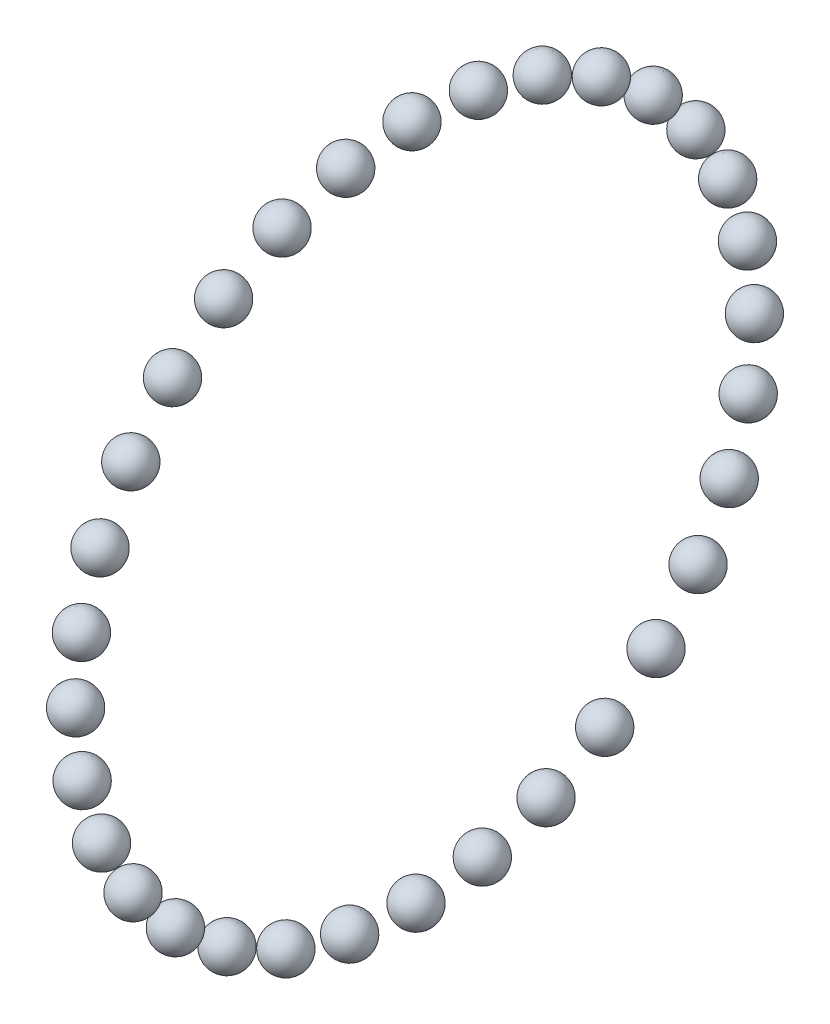
ISO-10303-21;
HEADER;
FILE_DESCRIPTION(('STEP AP214'),'2;1');
FILE_NAME('part.step','',(''),(''),'','','');
FILE_SCHEMA(('AUTOMOTIVE_DESIGN { 1 0 10303 214 1 1 1 1 }'));
ENDSEC;
DATA;
#1=APPLICATION_CONTEXT('core data for automotive mechanical design processes');
#2=APPLICATION_PROTOCOL_DEFINITION('international standard','automotive_design',2000,#1);
#3=PRODUCT_CONTEXT('',#1,'mechanical');
#4=PRODUCT('Part','Part','',(#3));
#5=PRODUCT_RELATED_PRODUCT_CATEGORY('part','',(#4));
#6=PRODUCT_DEFINITION_FORMATION('','',#4);
#7=PRODUCT_DEFINITION_CONTEXT('part definition',#1,'design');
#8=PRODUCT_DEFINITION('design','',#6,#7);
#9=PRODUCT_DEFINITION_SHAPE('','',#8);
#10=(LENGTH_UNIT() NAMED_UNIT(*) SI_UNIT(.MILLI.,.METRE.));
#11=(NAMED_UNIT(*) PLANE_ANGLE_UNIT() SI_UNIT($,.RADIAN.));
#12=(NAMED_UNIT(*) SI_UNIT($,.STERADIAN.) SOLID_ANGLE_UNIT());
#13=UNCERTAINTY_MEASURE_WITH_UNIT(LENGTH_MEASURE(1.E-05),#10,'distance_accuracy_value','');
#14=(GEOMETRIC_REPRESENTATION_CONTEXT(3) GLOBAL_UNCERTAINTY_ASSIGNED_CONTEXT((#13)) GLOBAL_UNIT_ASSIGNED_CONTEXT((#10,
#11,#12)) REPRESENTATION_CONTEXT('',''));
#15=CARTESIAN_POINT('',(0.,0.,0.));
#16=DIRECTION('',(0.,0.,1.));
#17=DIRECTION('',(1.,0.,0.));
#18=AXIS2_PLACEMENT_3D('',#15,#16,#17);
#19=CARTESIAN_POINT('',(0.,19.6178931008394,-1.81811366279537));
#20=DIRECTION('',(-1.,0.,0.));
#21=DIRECTION('',(0.,1.,0.));
#22=AXIS2_PLACEMENT_3D('',#19,#20,#21);
#23=SPHERICAL_SURFACE('',#22,6.5);
#24=CARTESIAN_POINT('',(-6.5,19.6178931008394,-1.81811366279537));
#25=VERTEX_POINT('',#24);
#26=VERTEX_LOOP('',#25);
#27=FACE_BOUND('',#26,.T.);
#28=ADVANCED_FACE('F38',(#27),#23,.T.);
#29=CLOSED_SHELL('',(#28));
#30=MANIFOLD_SOLID_BREP('B2',#29);
#31=CARTESIAN_POINT('',(0.,39.7489716881092,-7.67638217094377));
#32=DIRECTION('',(-1.,0.,0.));
#33=DIRECTION('',(0.,1.,0.));
#34=AXIS2_PLACEMENT_3D('',#31,#32,#33);
#35=SPHERICAL_SURFACE('',#34,6.5);
#36=CARTESIAN_POINT('',(-6.5,39.7489716881092,-7.67638217094377));
#37=VERTEX_POINT('',#36);
#38=VERTEX_LOOP('',#37);
#39=FACE_BOUND('',#38,.T.);
#40=ADVANCED_FACE('F57',(#39),#35,.T.);
#41=CLOSED_SHELL('',(#40));
#42=MANIFOLD_SOLID_BREP('B6',#41);
#43=CARTESIAN_POINT('',(0.,58.3467483022382,-17.3563790723563));
#44=DIRECTION('',(-1.,0.,0.));
#45=DIRECTION('',(0.,1.,0.));
#46=AXIS2_PLACEMENT_3D('',#43,#44,#45);
#47=SPHERICAL_SURFACE('',#46,6.5);
#48=CARTESIAN_POINT('',(-6.5,58.3467483022382,-17.3563790723563));
#49=VERTEX_POINT('',#48);
#50=VERTEX_LOOP('',#49);
#51=FACE_BOUND('',#50,.T.);
#52=ADVANCED_FACE('F76',(#51),#47,.T.);
#53=CLOSED_SHELL('',(#52));
#54=MANIFOLD_SOLID_BREP('B34',#53);
#55=CARTESIAN_POINT('',(0.,74.6938205459459,-30.4847020444422));
#56=DIRECTION('',(-1.,0.,0.));
#57=DIRECTION('',(0.,1.,0.));
#58=AXIS2_PLACEMENT_3D('',#55,#56,#57);
#59=SPHERICAL_SURFACE('',#58,6.5);
#60=CARTESIAN_POINT('',(-6.5,74.6938205459459,-30.4847020444422));
#61=VERTEX_POINT('',#60);
#62=VERTEX_LOOP('',#61);
#63=FACE_BOUND('',#62,.T.);
#64=ADVANCED_FACE('F95',(#63),#59,.T.);
#65=CLOSED_SHELL('',(#64));
#66=MANIFOLD_SOLID_BREP('B53',#65);
#67=CARTESIAN_POINT('',(0.,88.1596061157951,-46.554930853866));
#68=DIRECTION('',(-1.,0.,0.));
#69=DIRECTION('',(0.,1.,0.));
#70=AXIS2_PLACEMENT_3D('',#67,#68,#69);
#71=SPHERICAL_SURFACE('',#70,6.5);
#72=CARTESIAN_POINT('',(-6.5,88.1596061157951,-46.554930853866));
#73=VERTEX_POINT('',#72);
#74=VERTEX_LOOP('',#73);
#75=FACE_BOUND('',#74,.T.);
#76=ADVANCED_FACE('F114',(#75),#71,.T.);
#77=CLOSED_SHELL('',(#76));
#78=MANIFOLD_SOLID_BREP('B72',#77);
#79=CARTESIAN_POINT('',(0.,98.2246672827762,-64.9471623309145));
#80=DIRECTION('',(-1.,0.,0.));
#81=DIRECTION('',(0.,1.,0.));
#82=AXIS2_PLACEMENT_3D('',#79,#80,#81);
#83=SPHERICAL_SURFACE('',#82,6.5);
#84=CARTESIAN_POINT('',(-6.5,98.2246672827762,-64.9471623309145));
#85=VERTEX_POINT('',#84);
#86=VERTEX_LOOP('',#85);
#87=FACE_BOUND('',#86,.T.);
#88=ADVANCED_FACE('F133',(#87),#83,.T.);
#89=CLOSED_SHELL('',(#88));
#90=MANIFOLD_SOLID_BREP('B91',#89);
#91=CARTESIAN_POINT('',(0.,104.500748011784,-84.9519229064218));
#92=DIRECTION('',(-1.,0.,0.));
#93=DIRECTION('',(0.,1.,0.));
#94=AXIS2_PLACEMENT_3D('',#91,#92,#93);
#95=SPHERICAL_SURFACE('',#94,6.5);
#96=CARTESIAN_POINT('',(-6.5,104.500748011784,-84.9519229064218));
#97=VERTEX_POINT('',#96);
#98=VERTEX_LOOP('',#97);
#99=FACE_BOUND('',#98,.T.);
#100=ADVANCED_FACE('F152',(#99),#95,.T.);
#101=CLOSED_SHELL('',(#100));
#102=MANIFOLD_SOLID_BREP('B110',#101);
#103=CARTESIAN_POINT('',(0.,106.74575079547,-105.797536293934));
#104=DIRECTION('',(-1.,0.,0.));
#105=DIRECTION('',(0.,1.,0.));
#106=AXIS2_PLACEMENT_3D('',#103,#104,#105);
#107=SPHERICAL_SURFACE('',#106,6.5);
#108=CARTESIAN_POINT('',(-6.5,106.74575079547,-105.797536293934));
#109=VERTEX_POINT('',#108);
#110=VERTEX_LOOP('',#109);
#111=FACE_BOUND('',#110,.T.);
#112=ADVANCED_FACE('F171',(#111),#107,.T.);
#113=CLOSED_SHELL('',(#112));
#114=MANIFOLD_SOLID_BREP('B129',#113);
#115=CARTESIAN_POINT('',(0.,104.873075476604,-126.67989061883));
#116=DIRECTION('',(-1.,0.,0.));
#117=DIRECTION('',(0.,1.,0.));
#118=AXIS2_PLACEMENT_3D('',#115,#116,#117);
#119=SPHERICAL_SURFACE('',#118,6.5);
#120=CARTESIAN_POINT('',(-6.5,104.873075476604,-126.67989061883));
#121=VERTEX_POINT('',#120);
#122=VERTEX_LOOP('',#121);
#123=FACE_BOUND('',#122,.T.);
#124=ADVANCED_FACE('F190',(#123),#119,.T.);
#125=CLOSED_SHELL('',(#124));
#126=MANIFOLD_SOLID_BREP('B148',#125);
#127=CARTESIAN_POINT('',(0.,98.9549598173089,-146.793456738333));
#128=DIRECTION('',(-1.,0.,0.));
#129=DIRECTION('',(0.,1.,0.));
#130=AXIS2_PLACEMENT_3D('',#127,#128,#129);
#131=SPHERICAL_SURFACE('',#130,6.5);
#132=CARTESIAN_POINT('',(-6.5,98.9549598173089,-146.793456738333));
#133=VERTEX_POINT('',#132);
#134=VERTEX_LOOP('',#133);
#135=FACE_BOUND('',#134,.T.);
#136=ADVANCED_FACE('F209',(#135),#131,.T.);
#137=CLOSED_SHELL('',(#136));
#138=MANIFOLD_SOLID_BREP('B167',#137);
#139=CARTESIAN_POINT('',(0.,89.2196929539404,-165.362361232121));
#140=DIRECTION('',(-1.,0.,0.));
#141=DIRECTION('',(0.,1.,0.));
#142=AXIS2_PLACEMENT_3D('',#139,#140,#141);
#143=SPHERICAL_SURFACE('',#142,6.5);
#144=CARTESIAN_POINT('',(-6.5,89.2196929539404,-165.362361232121));
#145=VERTEX_POINT('',#144);
#146=VERTEX_LOOP('',#145);
#147=FACE_BOUND('',#146,.T.);
#148=ADVANCED_FACE('F228',(#147),#143,.T.);
#149=CLOSED_SHELL('',(#148));
#150=MANIFOLD_SOLID_BREP('B186',#149);
#151=CARTESIAN_POINT('',(0.,76.0428092275569,-181.670315434342));
#152=DIRECTION('',(-1.,0.,0.));
#153=DIRECTION('',(0.,1.,0.));
#154=AXIS2_PLACEMENT_3D('',#151,#152,#153);
#155=SPHERICAL_SURFACE('',#154,6.5);
#156=CARTESIAN_POINT('',(-6.5,76.0428092275569,-181.670315434342));
#157=VERTEX_POINT('',#156);
#158=VERTEX_LOOP('',#157);
#159=FACE_BOUND('',#158,.T.);
#160=ADVANCED_FACE('F247',(#159),#155,.T.);
#161=CLOSED_SHELL('',(#160));
#162=MANIFOLD_SOLID_BREP('B205',#161);
#163=CARTESIAN_POINT('',(0.,59.9326020847422,-195.088246005634));
#164=DIRECTION('',(-1.,0.,0.));
#165=DIRECTION('',(0.,1.,0.));
#166=AXIS2_PLACEMENT_3D('',#163,#164,#165);
#167=SPHERICAL_SURFACE('',#166,6.5);
#168=CARTESIAN_POINT('',(-6.5,59.9326020847422,-195.088246005634));
#169=VERTEX_POINT('',#168);
#170=VERTEX_LOOP('',#169);
#171=FACE_BOUND('',#170,.T.);
#172=ADVANCED_FACE('F266',(#171),#167,.T.);
#173=CLOSED_SHELL('',(#172));
#174=MANIFOLD_SOLID_BREP('B224',#173);
#175=CARTESIAN_POINT('',(0.,41.5105168447267,-205.098561205966));
#176=DIRECTION('',(-1.,0.,0.));
#177=DIRECTION('',(0.,1.,0.));
#178=AXIS2_PLACEMENT_3D('',#175,#176,#177);
#179=SPHERICAL_SURFACE('',#178,6.5);
#180=CARTESIAN_POINT('',(-6.5,41.5105168447267,-205.098561205966));
#181=VERTEX_POINT('',#180);
#182=VERTEX_LOOP('',#181);
#183=FACE_BOUND('',#182,.T.);
#184=ADVANCED_FACE('F285',(#183),#179,.T.);
#185=CLOSED_SHELL('',(#184));
#186=MANIFOLD_SOLID_BREP('B243',#185);
#187=CARTESIAN_POINT('',(0.,21.4871786746092,-211.315116805775));
#188=DIRECTION('',(-1.,0.,0.));
#189=DIRECTION('',(0.,1.,0.));
#190=AXIS2_PLACEMENT_3D('',#187,#188,#189);
#191=SPHERICAL_SURFACE('',#190,6.5);
#192=CARTESIAN_POINT('',(-6.5,21.4871786746092,-211.315116805775));
#193=VERTEX_POINT('',#192);
#194=VERTEX_LOOP('',#193);
#195=FACE_BOUND('',#194,.T.);
#196=ADVANCED_FACE('F304',(#195),#191,.T.);
#197=CLOSED_SHELL('',(#196));
#198=MANIFOLD_SOLID_BREP('B262',#197);
#199=CARTESIAN_POINT('',(0.,0.634980484727721,-213.498111457693));
#200=DIRECTION('',(-1.,0.,0.));
#201=DIRECTION('',(0.,1.,0.));
#202=AXIS2_PLACEMENT_3D('',#199,#200,#201);
#203=SPHERICAL_SURFACE('',#202,6.5);
#204=CARTESIAN_POINT('',(-6.5,0.634980484727721,-213.498111457693));
#205=VERTEX_POINT('',#204);
#206=VERTEX_LOOP('',#205);
#207=FACE_BOUND('',#206,.T.);
#208=ADVANCED_FACE('F323',(#207),#203,.T.);
#209=CLOSED_SHELL('',(#208));
#210=MANIFOLD_SOLID_BREP('B281',#209);
#211=CARTESIAN_POINT('',(0.,-20.2417118439652,-211.563336945381));
#212=DIRECTION('',(-1.,0.,0.));
#213=DIRECTION('',(0.,1.,0.));
#214=AXIS2_PLACEMENT_3D('',#211,#212,#213);
#215=SPHERICAL_SURFACE('',#214,6.5);
#216=CARTESIAN_POINT('',(-6.5,-20.2417118439652,-211.563336945381));
#217=VERTEX_POINT('',#216);
#218=VERTEX_LOOP('',#217);
#219=FACE_BOUND('',#218,.T.);
#220=ADVANCED_FACE('F342',(#219),#215,.T.);
#221=CLOSED_SHELL('',(#220));
#222=MANIFOLD_SOLID_BREP('B300',#221);
#223=CARTESIAN_POINT('',(0.,-40.337587578115,-205.585426484525));
#224=DIRECTION('',(-1.,0.,0.));
#225=DIRECTION('',(0.,1.,0.));
#226=AXIS2_PLACEMENT_3D('',#223,#224,#225);
#227=SPHERICAL_SURFACE('',#226,6.5);
#228=CARTESIAN_POINT('',(-6.5,-40.337587578115,-205.585426484525));
#229=VERTEX_POINT('',#228);
#230=VERTEX_LOOP('',#229);
#231=FACE_BOUND('',#230,.T.);
#232=ADVANCED_FACE('F361',(#231),#227,.T.);
#233=CLOSED_SHELL('',(#232));
#234=MANIFOLD_SOLID_BREP('B319',#233);
#235=CARTESIAN_POINT('',(0.,-58.8774556975125,-195.794975773973));
#236=DIRECTION('',(-1.,0.,0.));
#237=DIRECTION('',(0.,1.,0.));
#238=AXIS2_PLACEMENT_3D('',#235,#236,#237);
#239=SPHERICAL_SURFACE('',#238,6.5);
#240=CARTESIAN_POINT('',(-6.5,-58.8774556975125,-195.794975773973));
#241=VERTEX_POINT('',#240);
#242=VERTEX_LOOP('',#241);
#243=FACE_BOUND('',#242,.T.);
#244=ADVANCED_FACE('F380',(#243),#239,.T.);
#245=CLOSED_SHELL('',(#244));
#246=MANIFOLD_SOLID_BREP('B338',#245);
#247=CARTESIAN_POINT('',(0.,-75.1461476037777,-182.569647851406));
#248=DIRECTION('',(-1.,0.,0.));
#249=DIRECTION('',(0.,1.,0.));
#250=AXIS2_PLACEMENT_3D('',#247,#248,#249);
#251=SPHERICAL_SURFACE('',#250,6.5);
#252=CARTESIAN_POINT('',(-6.5,-75.1461476037777,-182.569647851406));
#253=VERTEX_POINT('',#252);
#254=VERTEX_LOOP('',#253);
#255=FACE_BOUND('',#254,.T.);
#256=ADVANCED_FACE('F399',(#255),#251,.T.);
#257=CLOSED_SHELL('',(#256));
#258=MANIFOLD_SOLID_BREP('B357',#257);
#259=CARTESIAN_POINT('',(0.,-88.5161044861811,-166.41960488047));
#260=DIRECTION('',(-1.,0.,0.));
#261=DIRECTION('',(0.,1.,0.));
#262=AXIS2_PLACEMENT_3D('',#259,#260,#261);
#263=SPHERICAL_SURFACE('',#262,6.5);
#264=CARTESIAN_POINT('',(-6.5,-88.5161044861811,-166.41960488047));
#265=VERTEX_POINT('',#264);
#266=VERTEX_LOOP('',#265);
#267=FACE_BOUND('',#266,.T.);
#268=ADVANCED_FACE('F418',(#267),#263,.T.);
#269=CLOSED_SHELL('',(#268));
#270=MANIFOLD_SOLID_BREP('B376',#269);
#271=CARTESIAN_POINT('',(0.,-98.4715851721095,-147.967828832824));
#272=DIRECTION('',(-1.,0.,0.));
#273=DIRECTION('',(0.,1.,0.));
#274=AXIS2_PLACEMENT_3D('',#271,#272,#273);
#275=SPHERICAL_SURFACE('',#274,6.5);
#276=CARTESIAN_POINT('',(-6.5,-98.4715851721095,-147.967828832824));
#277=VERTEX_POINT('',#276);
#278=VERTEX_LOOP('',#277);
#279=FACE_BOUND('',#278,.T.);
#280=ADVANCED_FACE('F437',(#279),#275,.T.);
#281=CLOSED_SHELL('',(#280));
#282=MANIFOLD_SOLID_BREP('B395',#281);
#283=CARTESIAN_POINT('',(0.,-104.628560653239,-127.926090187557));
#284=DIRECTION('',(-1.,0.,0.));
#285=DIRECTION('',(0.,1.,0.));
#286=AXIS2_PLACEMENT_3D('',#283,#284,#285);
#287=SPHERICAL_SURFACE('',#286,6.5);
#288=CARTESIAN_POINT('',(-6.5,-104.628560653239,-127.926090187557));
#289=VERTEX_POINT('',#288);
#290=VERTEX_LOOP('',#289);
#291=FACE_BOUND('',#290,.T.);
#292=ADVANCED_FACE('F456',(#291),#287,.T.);
#293=CLOSED_SHELL('',(#292));
#294=MANIFOLD_SOLID_BREP('B414',#293);
#295=CARTESIAN_POINT('',(0.,-106.749527863379,-107.067491646574));
#296=DIRECTION('',(-1.,0.,0.));
#297=DIRECTION('',(0.,1.,0.));
#298=AXIS2_PLACEMENT_3D('',#295,#296,#297);
#299=SPHERICAL_SURFACE('',#298,6.5);
#300=CARTESIAN_POINT('',(-6.5,-106.749527863379,-107.067491646574));
#301=VERTEX_POINT('',#300);
#302=VERTEX_LOOP('',#301);
#303=FACE_BOUND('',#302,.T.);
#304=ADVANCED_FACE('F475',(#303),#299,.T.);
#305=CLOSED_SHELL('',(#304));
#306=MANIFOLD_SOLID_BREP('B433',#305);
#307=CARTESIAN_POINT('',(0.,-104.752671271961,-86.1966459820182));
#308=DIRECTION('',(-1.,0.,0.));
#309=DIRECTION('',(0.,1.,0.));
#310=AXIS2_PLACEMENT_3D('',#307,#308,#309);
#311=SPHERICAL_SURFACE('',#310,6.5);
#312=CARTESIAN_POINT('',(-6.5,-104.752671271961,-86.1966459820182));
#313=VERTEX_POINT('',#312);
#314=VERTEX_LOOP('',#313);
#315=FACE_BOUND('',#314,.T.);
#316=ADVANCED_FACE('F494',(#315),#311,.T.);
#317=CLOSED_SHELL('',(#316));
#318=MANIFOLD_SOLID_BREP('B452',#317);
#319=CARTESIAN_POINT('',(0.,-98.7150188880537,-66.1186383943241));
#320=DIRECTION('',(-1.,0.,0.));
#321=DIRECTION('',(0.,1.,0.));
#322=AXIS2_PLACEMENT_3D('',#319,#320,#321);
#323=SPHERICAL_SURFACE('',#322,6.5);
#324=CARTESIAN_POINT('',(-6.5,-98.7150188880537,-66.1186383943241));
#325=VERTEX_POINT('',#324);
#326=VERTEX_LOOP('',#325);
#327=FACE_BOUND('',#326,.T.);
#328=ADVANCED_FACE('F513',(#327),#323,.T.);
#329=CLOSED_SHELL('',(#328));
#330=MANIFOLD_SOLID_BREP('B471',#329);
#331=CARTESIAN_POINT('',(0.,-88.8694709332286,-47.6079706465188));
#332=DIRECTION('',(-1.,0.,0.));
#333=DIRECTION('',(0.,1.,0.));
#334=AXIS2_PLACEMENT_3D('',#331,#332,#333);
#335=SPHERICAL_SURFACE('',#334,6.5);
#336=CARTESIAN_POINT('',(-6.5,-88.8694709332286,-47.6079706465188));
#337=VERTEX_POINT('',#336);
#338=VERTEX_LOOP('',#337);
#339=FACE_BOUND('',#338,.T.);
#340=ADVANCED_FACE('F532',(#339),#335,.T.);
#341=CLOSED_SHELL('',(#340));
#342=MANIFOLD_SOLID_BREP('B490',#341);
#343=CARTESIAN_POINT('',(0.,-75.5958158011134,-31.378684943381));
#344=DIRECTION('',(-1.,0.,0.));
#345=DIRECTION('',(0.,1.,0.));
#346=AXIS2_PLACEMENT_3D('',#343,#344,#345);
#347=SPHERICAL_SURFACE('',#346,6.5);
#348=CARTESIAN_POINT('',(-6.5,-75.5958158011134,-31.378684943381));
#349=VERTEX_POINT('',#348);
#350=VERTEX_LOOP('',#349);
#351=FACE_BOUND('',#350,.T.);
#352=ADVANCED_FACE('F551',(#351),#347,.T.);
#353=CLOSED_SHELL('',(#352));
#354=MANIFOLD_SOLID_BREP('B509',#353);
#355=CARTESIAN_POINT('',(0.,-59.4060798597,-18.0568200158381));
#356=DIRECTION('',(-1.,0.,0.));
#357=DIRECTION('',(0.,1.,0.));
#358=AXIS2_PLACEMENT_3D('',#355,#356,#357);
#359=SPHERICAL_SURFACE('',#358,6.5);
#360=CARTESIAN_POINT('',(-6.5,-59.4060798597,-18.0568200158381));
#361=VERTEX_POINT('',#360);
#362=VERTEX_LOOP('',#361);
#363=FACE_BOUND('',#362,.T.);
#364=ADVANCED_FACE('F570',(#363),#359,.T.);
#365=CLOSED_SHELL('',(#364));
#366=MANIFOLD_SOLID_BREP('B528',#365);
#367=CARTESIAN_POINT('',(0.,-40.9247762223932,-8.15626190702053));
#368=DIRECTION('',(-1.,0.,0.));
#369=DIRECTION('',(0.,1.,0.));
#370=AXIS2_PLACEMENT_3D('',#367,#368,#369);
#371=SPHERICAL_SURFACE('',#370,6.5);
#372=CARTESIAN_POINT('',(-6.5,-40.9247762223932,-8.15626190702053));
#373=VERTEX_POINT('',#372);
#374=VERTEX_LOOP('',#373);
#375=FACE_BOUND('',#374,.T.);
#376=ADVANCED_FACE('F589',(#375),#371,.T.);
#377=CLOSED_SHELL('',(#376));
#378=MANIFOLD_SOLID_BREP('B547',#377);
#379=CARTESIAN_POINT('',(0.,-20.8648143842023,-2.05892100702766));
#380=DIRECTION('',(-1.,0.,0.));
#381=DIRECTION('',(0.,1.,0.));
#382=AXIS2_PLACEMENT_3D('',#379,#380,#381);
#383=SPHERICAL_SURFACE('',#382,6.5);
#384=CARTESIAN_POINT('',(-6.5,-20.8648143842023,-2.05892100702766));
#385=VERTEX_POINT('',#384);
#386=VERTEX_LOOP('',#385);
#387=FACE_BOUND('',#386,.T.);
#388=ADVANCED_FACE('F607',(#387),#383,.T.);
#389=CLOSED_SHELL('',(#388));
#390=MANIFOLD_SOLID_BREP('B566',#389);
#391=CARTESIAN_POINT('',(0.,0.,0.));
#392=DIRECTION('',(-1.,0.,0.));
#393=DIRECTION('',(0.,1.,0.));
#394=AXIS2_PLACEMENT_3D('',#391,#392,#393);
#395=SPHERICAL_SURFACE('',#394,6.5);
#396=CARTESIAN_POINT('',(-6.5,0.,0.));
#397=VERTEX_POINT('',#396);
#398=VERTEX_LOOP('',#397);
#399=FACE_BOUND('',#398,.T.);
#400=ADVANCED_FACE('F620',(#399),#395,.T.);
#401=CLOSED_SHELL('',(#400));
#402=MANIFOLD_SOLID_BREP('B585',#401);
#403=ADVANCED_BREP_SHAPE_REPRESENTATION('',(#18,#30,#42,#54,#66,#78,#90,#102,#114,#126,#138,
#150,#162,#174,#186,#198,#210,#222,#234,#246,#258,#270,#282,#294,#306,#318,#330,#342,#354,#366,
#378,#390,#402),#14);
#404=SHAPE_DEFINITION_REPRESENTATION(#9,#403);
ENDSEC;
END-ISO-10303-21;
